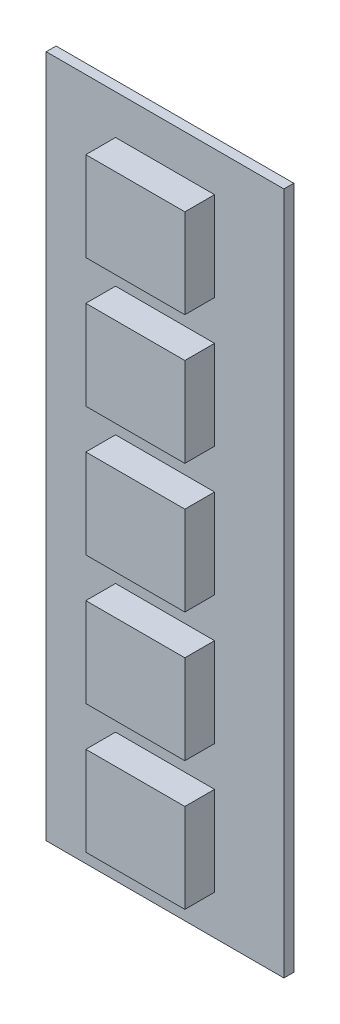
ISO-10303-21;
HEADER;
FILE_DESCRIPTION(('STEP AP214'),'2;1');
FILE_NAME('part.step','',(''),(''),'','','');
FILE_SCHEMA(('AUTOMOTIVE_DESIGN { 1 0 10303 214 1 1 1 1 }'));
ENDSEC;
DATA;
#1=APPLICATION_CONTEXT('core data for automotive mechanical design processes');
#2=APPLICATION_PROTOCOL_DEFINITION('international standard','automotive_design',2000,#1);
#3=PRODUCT_CONTEXT('',#1,'mechanical');
#4=PRODUCT('Part','Part','',(#3));
#5=PRODUCT_RELATED_PRODUCT_CATEGORY('part','',(#4));
#6=PRODUCT_DEFINITION_FORMATION('','',#4);
#7=PRODUCT_DEFINITION_CONTEXT('part definition',#1,'design');
#8=PRODUCT_DEFINITION('design','',#6,#7);
#9=PRODUCT_DEFINITION_SHAPE('','',#8);
#10=(LENGTH_UNIT() NAMED_UNIT(*) SI_UNIT(.MILLI.,.METRE.));
#11=(NAMED_UNIT(*) PLANE_ANGLE_UNIT() SI_UNIT($,.RADIAN.));
#12=(NAMED_UNIT(*) SI_UNIT($,.STERADIAN.) SOLID_ANGLE_UNIT());
#13=UNCERTAINTY_MEASURE_WITH_UNIT(LENGTH_MEASURE(1.E-05),#10,'distance_accuracy_value','');
#14=(GEOMETRIC_REPRESENTATION_CONTEXT(3) GLOBAL_UNCERTAINTY_ASSIGNED_CONTEXT((#13)) GLOBAL_UNIT_ASSIGNED_CONTEXT((#10,
#11,#12)) REPRESENTATION_CONTEXT('',''));
#15=CARTESIAN_POINT('',(0.,0.,0.));
#16=DIRECTION('',(0.,0.,1.));
#17=DIRECTION('',(1.,0.,0.));
#18=AXIS2_PLACEMENT_3D('',#15,#16,#17);
#19=CARTESIAN_POINT('',(0.,0.,0.5));
#20=DIRECTION('',(0.,0.,1.));
#21=DIRECTION('',(1.,0.,0.));
#22=AXIS2_PLACEMENT_3D('',#19,#20,#21);
#23=PLANE('',#22);
#24=DIRECTION('',(0.,-1.,0.));
#25=VECTOR('',#24,1.);
#26=CARTESIAN_POINT('',(-12.,35.2631521081853,0.5));
#27=LINE('',#26,#25);
#28=CARTESIAN_POINT('',(-12.,35.2631521081853,0.5));
#29=VERTEX_POINT('',#28);
#30=CARTESIAN_POINT('',(-12.,0.763152108185262,0.5));
#31=VERTEX_POINT('',#30);
#32=EDGE_CURVE('E398',#29,#31,#27,.T.);
#33=ORIENTED_EDGE('',*,*,#32,.T.);
#34=DIRECTION('',(1.,0.,0.));
#35=VECTOR('',#34,1.);
#36=CARTESIAN_POINT('',(-12.,0.763152108185262,0.5));
#37=LINE('',#36,#35);
#38=CARTESIAN_POINT('',(0.,0.763152108185262,0.5));
#39=VERTEX_POINT('',#38);
#40=EDGE_CURVE('E402',#31,#39,#37,.T.);
#41=ORIENTED_EDGE('',*,*,#40,.T.);
#42=DIRECTION('',(0.,1.,0.));
#43=VECTOR('',#42,1.);
#44=CARTESIAN_POINT('',(0.,35.2631521081853,0.5));
#45=LINE('',#44,#43);
#46=CARTESIAN_POINT('',(0.,35.2631521081853,0.5));
#47=VERTEX_POINT('',#46);
#48=EDGE_CURVE('E406',#39,#47,#45,.T.);
#49=ORIENTED_EDGE('',*,*,#48,.T.);
#50=DIRECTION('',(-1.,0.,0.));
#51=VECTOR('',#50,1.);
#52=CARTESIAN_POINT('',(-12.,35.2631521081853,0.5));
#53=LINE('',#52,#51);
#54=EDGE_CURVE('E409',#47,#29,#53,.T.);
#55=ORIENTED_EDGE('',*,*,#54,.T.);
#56=EDGE_LOOP('',(#33,#41,#49,#55));
#57=FACE_BOUND('',#56,.T.);
#58=DIRECTION('',(1.,0.,0.));
#59=VECTOR('',#58,1.);
#60=CARTESIAN_POINT('',(-8.5,28.7631521081853,0.5));
#61=LINE('',#60,#59);
#62=CARTESIAN_POINT('',(-8.5,28.7631521081853,0.5));
#63=VERTEX_POINT('',#62);
#64=CARTESIAN_POINT('',(-3.5,28.7631521081853,0.5));
#65=VERTEX_POINT('',#64);
#66=EDGE_CURVE('E375',#63,#65,#61,.T.);
#67=ORIENTED_EDGE('',*,*,#66,.F.);
#68=DIRECTION('',(0.,-1.,0.));
#69=VECTOR('',#68,1.);
#70=CARTESIAN_POINT('',(-8.5,33.2631521081853,0.5));
#71=LINE('',#70,#69);
#72=CARTESIAN_POINT('',(-8.5,33.2631521081853,0.5));
#73=VERTEX_POINT('',#72);
#74=EDGE_CURVE('E356',#73,#63,#71,.T.);
#75=ORIENTED_EDGE('',*,*,#74,.F.);
#76=DIRECTION('',(-1.,0.,0.));
#77=VECTOR('',#76,1.);
#78=CARTESIAN_POINT('',(-8.5,33.2631521081853,0.5));
#79=LINE('',#78,#77);
#80=CARTESIAN_POINT('',(-3.5,33.2631521081853,0.5));
#81=VERTEX_POINT('',#80);
#82=EDGE_CURVE('E362',#81,#73,#79,.T.);
#83=ORIENTED_EDGE('',*,*,#82,.F.);
#84=DIRECTION('',(0.,1.,0.));
#85=VECTOR('',#84,1.);
#86=CARTESIAN_POINT('',(-3.5,33.2631521081853,0.5));
#87=LINE('',#86,#85);
#88=EDGE_CURVE('E378',#65,#81,#87,.T.);
#89=ORIENTED_EDGE('',*,*,#88,.F.);
#90=EDGE_LOOP('',(#67,#75,#83,#89));
#91=FACE_BOUND('',#90,.T.);
#92=DIRECTION('',(0.,-1.,0.));
#93=VECTOR('',#92,1.);
#94=CARTESIAN_POINT('',(-8.5,26.7631521081853,0.5));
#95=LINE('',#94,#93);
#96=CARTESIAN_POINT('',(-8.5,26.7631521081853,0.5));
#97=VERTEX_POINT('',#96);
#98=CARTESIAN_POINT('',(-8.5,22.2631521081853,0.5));
#99=VERTEX_POINT('',#98);
#100=EDGE_CURVE('E334',#97,#99,#95,.T.);
#101=ORIENTED_EDGE('',*,*,#100,.F.);
#102=DIRECTION('',(-1.,0.,0.));
#103=VECTOR('',#102,1.);
#104=CARTESIAN_POINT('',(-8.5,26.7631521081853,0.5));
#105=LINE('',#104,#103);
#106=CARTESIAN_POINT('',(-3.5,26.7631521081853,0.5));
#107=VERTEX_POINT('',#106);
#108=EDGE_CURVE('E315',#107,#97,#105,.T.);
#109=ORIENTED_EDGE('',*,*,#108,.F.);
#110=DIRECTION('',(0.,1.,0.));
#111=VECTOR('',#110,1.);
#112=CARTESIAN_POINT('',(-3.5,26.7631521081853,0.5));
#113=LINE('',#112,#111);
#114=CARTESIAN_POINT('',(-3.5,22.2631521081853,0.5));
#115=VERTEX_POINT('',#114);
#116=EDGE_CURVE('E321',#115,#107,#113,.T.);
#117=ORIENTED_EDGE('',*,*,#116,.F.);
#118=DIRECTION('',(1.,0.,0.));
#119=VECTOR('',#118,1.);
#120=CARTESIAN_POINT('',(-8.5,22.2631521081853,0.5));
#121=LINE('',#120,#119);
#122=EDGE_CURVE('E337',#99,#115,#121,.T.);
#123=ORIENTED_EDGE('',*,*,#122,.F.);
#124=EDGE_LOOP('',(#101,#109,#117,#123));
#125=FACE_BOUND('',#124,.T.);
#126=DIRECTION('',(0.,-1.,0.));
#127=VECTOR('',#126,1.);
#128=CARTESIAN_POINT('',(-8.5,20.2631521081853,0.5));
#129=LINE('',#128,#127);
#130=CARTESIAN_POINT('',(-8.5,20.2631521081853,0.5));
#131=VERTEX_POINT('',#130);
#132=CARTESIAN_POINT('',(-8.5,15.7631521081853,0.5));
#133=VERTEX_POINT('',#132);
#134=EDGE_CURVE('E293',#131,#133,#129,.T.);
#135=ORIENTED_EDGE('',*,*,#134,.F.);
#136=DIRECTION('',(-1.,0.,0.));
#137=VECTOR('',#136,1.);
#138=CARTESIAN_POINT('',(-8.5,20.2631521081853,0.5));
#139=LINE('',#138,#137);
#140=CARTESIAN_POINT('',(-3.5,20.2631521081853,0.5));
#141=VERTEX_POINT('',#140);
#142=EDGE_CURVE('E274',#141,#131,#139,.T.);
#143=ORIENTED_EDGE('',*,*,#142,.F.);
#144=DIRECTION('',(0.,1.,0.));
#145=VECTOR('',#144,1.);
#146=CARTESIAN_POINT('',(-3.5,20.2631521081853,0.5));
#147=LINE('',#146,#145);
#148=CARTESIAN_POINT('',(-3.5,15.7631521081853,0.5));
#149=VERTEX_POINT('',#148);
#150=EDGE_CURVE('E280',#149,#141,#147,.T.);
#151=ORIENTED_EDGE('',*,*,#150,.F.);
#152=DIRECTION('',(1.,0.,0.));
#153=VECTOR('',#152,1.);
#154=CARTESIAN_POINT('',(-8.5,15.7631521081853,0.5));
#155=LINE('',#154,#153);
#156=EDGE_CURVE('E296',#133,#149,#155,.T.);
#157=ORIENTED_EDGE('',*,*,#156,.F.);
#158=EDGE_LOOP('',(#135,#143,#151,#157));
#159=FACE_BOUND('',#158,.T.);
#160=DIRECTION('',(0.,-1.,0.));
#161=VECTOR('',#160,1.);
#162=CARTESIAN_POINT('',(-8.5,13.7631521081853,0.5));
#163=LINE('',#162,#161);
#164=CARTESIAN_POINT('',(-8.5,13.7631521081853,0.5));
#165=VERTEX_POINT('',#164);
#166=CARTESIAN_POINT('',(-8.5,9.26315210818527,0.5));
#167=VERTEX_POINT('',#166);
#168=EDGE_CURVE('E235',#165,#167,#163,.T.);
#169=ORIENTED_EDGE('',*,*,#168,.F.);
#170=DIRECTION('',(-1.,0.,0.));
#171=VECTOR('',#170,1.);
#172=CARTESIAN_POINT('',(-8.5,13.7631521081853,0.5));
#173=LINE('',#172,#171);
#174=CARTESIAN_POINT('',(-3.5,13.7631521081853,0.5));
#175=VERTEX_POINT('',#174);
#176=EDGE_CURVE('E230',#175,#165,#173,.T.);
#177=ORIENTED_EDGE('',*,*,#176,.F.);
#178=DIRECTION('',(0.,1.,0.));
#179=VECTOR('',#178,1.);
#180=CARTESIAN_POINT('',(-3.5,13.7631521081853,0.5));
#181=LINE('',#180,#179);
#182=CARTESIAN_POINT('',(-3.5,9.26315210818527,0.5));
#183=VERTEX_POINT('',#182);
#184=EDGE_CURVE('E245',#183,#175,#181,.T.);
#185=ORIENTED_EDGE('',*,*,#184,.F.);
#186=DIRECTION('',(1.,0.,0.));
#187=VECTOR('',#186,1.);
#188=CARTESIAN_POINT('',(-8.5,9.26315210818527,0.5));
#189=LINE('',#188,#187);
#190=EDGE_CURVE('E257',#167,#183,#189,.T.);
#191=ORIENTED_EDGE('',*,*,#190,.F.);
#192=EDGE_LOOP('',(#169,#177,#185,#191));
#193=FACE_BOUND('',#192,.T.);
#194=DIRECTION('',(0.,-1.,0.));
#195=VECTOR('',#194,1.);
#196=CARTESIAN_POINT('',(-8.5,7.26315210818527,0.5));
#197=LINE('',#196,#195);
#198=CARTESIAN_POINT('',(-8.5,7.26315210818527,0.5));
#199=VERTEX_POINT('',#198);
#200=CARTESIAN_POINT('',(-8.5,2.76315210818527,0.5));
#201=VERTEX_POINT('',#200);
#202=EDGE_CURVE('E750',#199,#201,#197,.T.);
#203=ORIENTED_EDGE('',*,*,#202,.F.);
#204=DIRECTION('',(-1.,0.,0.));
#205=VECTOR('',#204,1.);
#206=CARTESIAN_POINT('',(-8.5,7.26315210818527,0.5));
#207=LINE('',#206,#205);
#208=CARTESIAN_POINT('',(-3.5,7.26315210818527,0.5));
#209=VERTEX_POINT('',#208);
#210=EDGE_CURVE('E227',#209,#199,#207,.T.);
#211=ORIENTED_EDGE('',*,*,#210,.F.);
#212=DIRECTION('',(0.,1.,0.));
#213=VECTOR('',#212,1.);
#214=CARTESIAN_POINT('',(-3.5,7.26315210818527,0.5));
#215=LINE('',#214,#213);
#216=CARTESIAN_POINT('',(-3.5,2.76315210818527,0.5));
#217=VERTEX_POINT('',#216);
#218=EDGE_CURVE('E223',#217,#209,#215,.T.);
#219=ORIENTED_EDGE('',*,*,#218,.F.);
#220=DIRECTION('',(1.,0.,0.));
#221=VECTOR('',#220,1.);
#222=CARTESIAN_POINT('',(-8.5,2.76315210818527,0.5));
#223=LINE('',#222,#221);
#224=EDGE_CURVE('E746',#201,#217,#223,.T.);
#225=ORIENTED_EDGE('',*,*,#224,.F.);
#226=EDGE_LOOP('',(#203,#211,#219,#225));
#227=FACE_BOUND('',#226,.T.);
#228=ADVANCED_FACE('F39',(#57,#91,#125,#159,#193,#227),#23,.T.);
#229=CARTESIAN_POINT('',(-12.,35.2631521081853,0.5));
#230=DIRECTION('',(1.,0.,0.));
#231=DIRECTION('',(0.,1.,0.));
#232=AXIS2_PLACEMENT_3D('',#229,#230,#231);
#233=PLANE('',#232);
#234=DIRECTION('',(0.,-1.,0.));
#235=VECTOR('',#234,1.);
#236=CARTESIAN_POINT('',(-12.,35.2631521081853,0.));
#237=LINE('',#236,#235);
#238=CARTESIAN_POINT('',(-12.,35.2631521081853,0.));
#239=VERTEX_POINT('',#238);
#240=CARTESIAN_POINT('',(-12.,0.763152108185262,0.));
#241=VERTEX_POINT('',#240);
#242=EDGE_CURVE('E397',#239,#241,#237,.T.);
#243=ORIENTED_EDGE('',*,*,#242,.T.);
#244=DIRECTION('',(0.,0.,-1.));
#245=VECTOR('',#244,1.);
#246=CARTESIAN_POINT('',(-12.,0.763152108185262,0.5));
#247=LINE('',#246,#245);
#248=EDGE_CURVE('E11',#31,#241,#247,.T.);
#249=ORIENTED_EDGE('',*,*,#248,.F.);
#250=ORIENTED_EDGE('',*,*,#32,.F.);
#251=DIRECTION('',(0.,0.,-1.));
#252=VECTOR('',#251,1.);
#253=CARTESIAN_POINT('',(-12.,35.2631521081853,0.5));
#254=LINE('',#253,#252);
#255=EDGE_CURVE('E412',#29,#239,#254,.T.);
#256=ORIENTED_EDGE('',*,*,#255,.T.);
#257=EDGE_LOOP('',(#243,#249,#250,#256));
#258=FACE_BOUND('',#257,.T.);
#259=ADVANCED_FACE('F41',(#258),#233,.F.);
#260=CARTESIAN_POINT('',(-12.,0.763152108185262,0.5));
#261=DIRECTION('',(0.,1.,0.));
#262=DIRECTION('',(0.,0.,1.));
#263=AXIS2_PLACEMENT_3D('',#260,#261,#262);
#264=PLANE('',#263);
#265=DIRECTION('',(1.,0.,0.));
#266=VECTOR('',#265,1.);
#267=CARTESIAN_POINT('',(-12.,0.763152108185262,0.));
#268=LINE('',#267,#266);
#269=CARTESIAN_POINT('',(0.,0.763152108185262,0.));
#270=VERTEX_POINT('',#269);
#271=EDGE_CURVE('E416',#241,#270,#268,.T.);
#272=ORIENTED_EDGE('',*,*,#271,.T.);
#273=DIRECTION('',(0.,0.,-1.));
#274=VECTOR('',#273,1.);
#275=CARTESIAN_POINT('',(0.,0.763152108185262,0.5));
#276=LINE('',#275,#274);
#277=EDGE_CURVE('E48',#39,#270,#276,.T.);
#278=ORIENTED_EDGE('',*,*,#277,.F.);
#279=ORIENTED_EDGE('',*,*,#40,.F.);
#280=ORIENTED_EDGE('',*,*,#248,.T.);
#281=EDGE_LOOP('',(#272,#278,#279,#280));
#282=FACE_BOUND('',#281,.T.);
#283=ADVANCED_FACE('F452',(#282),#264,.F.);
#284=CARTESIAN_POINT('',(0.,35.2631521081853,0.5));
#285=DIRECTION('',(-1.,0.,0.));
#286=DIRECTION('',(0.,-1.,0.));
#287=AXIS2_PLACEMENT_3D('',#284,#285,#286);
#288=PLANE('',#287);
#289=DIRECTION('',(0.,1.,0.));
#290=VECTOR('',#289,1.);
#291=CARTESIAN_POINT('',(0.,35.2631521081853,0.));
#292=LINE('',#291,#290);
#293=CARTESIAN_POINT('',(0.,35.2631521081853,0.));
#294=VERTEX_POINT('',#293);
#295=EDGE_CURVE('E419',#270,#294,#292,.T.);
#296=ORIENTED_EDGE('',*,*,#295,.T.);
#297=DIRECTION('',(0.,0.,-1.));
#298=VECTOR('',#297,1.);
#299=CARTESIAN_POINT('',(0.,35.2631521081853,0.5));
#300=LINE('',#299,#298);
#301=EDGE_CURVE('E427',#47,#294,#300,.T.);
#302=ORIENTED_EDGE('',*,*,#301,.F.);
#303=ORIENTED_EDGE('',*,*,#48,.F.);
#304=ORIENTED_EDGE('',*,*,#277,.T.);
#305=EDGE_LOOP('',(#296,#302,#303,#304));
#306=FACE_BOUND('',#305,.T.);
#307=ADVANCED_FACE('F436',(#306),#288,.F.);
#308=CARTESIAN_POINT('',(-12.,35.2631521081853,0.5));
#309=DIRECTION('',(0.,-1.,0.));
#310=DIRECTION('',(0.,0.,-1.));
#311=AXIS2_PLACEMENT_3D('',#308,#309,#310);
#312=PLANE('',#311);
#313=DIRECTION('',(-1.,0.,0.));
#314=VECTOR('',#313,1.);
#315=CARTESIAN_POINT('',(-12.,35.2631521081853,0.));
#316=LINE('',#315,#314);
#317=EDGE_CURVE('E403',#294,#239,#316,.T.);
#318=ORIENTED_EDGE('',*,*,#317,.T.);
#319=ORIENTED_EDGE('',*,*,#255,.F.);
#320=ORIENTED_EDGE('',*,*,#54,.F.);
#321=ORIENTED_EDGE('',*,*,#301,.T.);
#322=EDGE_LOOP('',(#318,#319,#320,#321));
#323=FACE_BOUND('',#322,.T.);
#324=ADVANCED_FACE('F445',(#323),#312,.F.);
#325=CARTESIAN_POINT('',(0.,0.,0.));
#326=DIRECTION('',(0.,0.,1.));
#327=DIRECTION('',(1.,0.,0.));
#328=AXIS2_PLACEMENT_3D('',#325,#326,#327);
#329=PLANE('',#328);
#330=ORIENTED_EDGE('',*,*,#242,.F.);
#331=ORIENTED_EDGE('',*,*,#317,.F.);
#332=ORIENTED_EDGE('',*,*,#295,.F.);
#333=ORIENTED_EDGE('',*,*,#271,.F.);
#334=EDGE_LOOP('',(#330,#331,#332,#333));
#335=FACE_BOUND('',#334,.T.);
#336=ADVANCED_FACE('F442',(#335),#329,.F.);
#337=CARTESIAN_POINT('',(-8.5,33.2631521081853,2.));
#338=DIRECTION('',(1.,0.,0.));
#339=DIRECTION('',(0.,0.,-1.));
#340=AXIS2_PLACEMENT_3D('',#337,#338,#339);
#341=PLANE('',#340);
#342=ORIENTED_EDGE('',*,*,#74,.T.);
#343=DIRECTION('',(0.,0.,-1.));
#344=VECTOR('',#343,1.);
#345=CARTESIAN_POINT('',(-8.5,28.7631521081853,2.));
#346=LINE('',#345,#344);
#347=CARTESIAN_POINT('',(-8.5,28.7631521081853,2.));
#348=VERTEX_POINT('',#347);
#349=EDGE_CURVE('E394',#348,#63,#346,.T.);
#350=ORIENTED_EDGE('',*,*,#349,.F.);
#351=DIRECTION('',(0.,-1.,0.));
#352=VECTOR('',#351,1.);
#353=CARTESIAN_POINT('',(-8.5,33.2631521081853,2.));
#354=LINE('',#353,#352);
#355=CARTESIAN_POINT('',(-8.5,33.2631521081853,2.));
#356=VERTEX_POINT('',#355);
#357=EDGE_CURVE('E357',#356,#348,#354,.T.);
#358=ORIENTED_EDGE('',*,*,#357,.F.);
#359=DIRECTION('',(0.,0.,-1.));
#360=VECTOR('',#359,1.);
#361=CARTESIAN_POINT('',(-8.5,33.2631521081853,2.));
#362=LINE('',#361,#360);
#363=EDGE_CURVE('E371',#356,#73,#362,.T.);
#364=ORIENTED_EDGE('',*,*,#363,.T.);
#365=EDGE_LOOP('',(#342,#350,#358,#364));
#366=FACE_BOUND('',#365,.T.);
#367=ADVANCED_FACE('F465',(#366),#341,.F.);
#368=CARTESIAN_POINT('',(-8.5,28.7631521081853,2.));
#369=DIRECTION('',(0.,1.,0.));
#370=DIRECTION('',(0.,0.,1.));
#371=AXIS2_PLACEMENT_3D('',#368,#369,#370);
#372=PLANE('',#371);
#373=ORIENTED_EDGE('',*,*,#66,.T.);
#374=DIRECTION('',(0.,0.,-1.));
#375=VECTOR('',#374,1.);
#376=CARTESIAN_POINT('',(-3.5,28.7631521081853,2.));
#377=LINE('',#376,#375);
#378=CARTESIAN_POINT('',(-3.5,28.7631521081853,2.));
#379=VERTEX_POINT('',#378);
#380=EDGE_CURVE('E390',#379,#65,#377,.T.);
#381=ORIENTED_EDGE('',*,*,#380,.F.);
#382=DIRECTION('',(1.,0.,0.));
#383=VECTOR('',#382,1.);
#384=CARTESIAN_POINT('',(-8.5,28.7631521081853,2.));
#385=LINE('',#384,#383);
#386=EDGE_CURVE('E361',#348,#379,#385,.T.);
#387=ORIENTED_EDGE('',*,*,#386,.F.);
#388=ORIENTED_EDGE('',*,*,#349,.T.);
#389=EDGE_LOOP('',(#373,#381,#387,#388));
#390=FACE_BOUND('',#389,.T.);
#391=ADVANCED_FACE('F484',(#390),#372,.F.);
#392=CARTESIAN_POINT('',(-3.5,33.2631521081853,2.));
#393=DIRECTION('',(-1.,0.,0.));
#394=DIRECTION('',(0.,0.,1.));
#395=AXIS2_PLACEMENT_3D('',#392,#393,#394);
#396=PLANE('',#395);
#397=ORIENTED_EDGE('',*,*,#88,.T.);
#398=DIRECTION('',(0.,0.,-1.));
#399=VECTOR('',#398,1.);
#400=CARTESIAN_POINT('',(-3.5,33.2631521081853,2.));
#401=LINE('',#400,#399);
#402=CARTESIAN_POINT('',(-3.5,33.2631521081853,2.));
#403=VERTEX_POINT('',#402);
#404=EDGE_CURVE('E387',#403,#81,#401,.T.);
#405=ORIENTED_EDGE('',*,*,#404,.F.);
#406=DIRECTION('',(0.,1.,0.));
#407=VECTOR('',#406,1.);
#408=CARTESIAN_POINT('',(-3.5,33.2631521081853,2.));
#409=LINE('',#408,#407);
#410=EDGE_CURVE('E365',#379,#403,#409,.T.);
#411=ORIENTED_EDGE('',*,*,#410,.F.);
#412=ORIENTED_EDGE('',*,*,#380,.T.);
#413=EDGE_LOOP('',(#397,#405,#411,#412));
#414=FACE_BOUND('',#413,.T.);
#415=ADVANCED_FACE('F491',(#414),#396,.F.);
#416=CARTESIAN_POINT('',(-8.5,33.2631521081853,2.));
#417=DIRECTION('',(0.,-1.,0.));
#418=DIRECTION('',(0.,0.,-1.));
#419=AXIS2_PLACEMENT_3D('',#416,#417,#418);
#420=PLANE('',#419);
#421=ORIENTED_EDGE('',*,*,#82,.T.);
#422=ORIENTED_EDGE('',*,*,#363,.F.);
#423=DIRECTION('',(-1.,0.,0.));
#424=VECTOR('',#423,1.);
#425=CARTESIAN_POINT('',(-8.5,33.2631521081853,2.));
#426=LINE('',#425,#424);
#427=EDGE_CURVE('E368',#403,#356,#426,.T.);
#428=ORIENTED_EDGE('',*,*,#427,.F.);
#429=ORIENTED_EDGE('',*,*,#404,.T.);
#430=EDGE_LOOP('',(#421,#422,#428,#429));
#431=FACE_BOUND('',#430,.T.);
#432=ADVANCED_FACE('F498',(#431),#420,.F.);
#433=CARTESIAN_POINT('',(0.,0.,2.));
#434=DIRECTION('',(0.,0.,1.));
#435=DIRECTION('',(1.,0.,0.));
#436=AXIS2_PLACEMENT_3D('',#433,#434,#435);
#437=PLANE('',#436);
#438=ORIENTED_EDGE('',*,*,#357,.T.);
#439=ORIENTED_EDGE('',*,*,#386,.T.);
#440=ORIENTED_EDGE('',*,*,#410,.T.);
#441=ORIENTED_EDGE('',*,*,#427,.T.);
#442=EDGE_LOOP('',(#438,#439,#440,#441));
#443=FACE_BOUND('',#442,.T.);
#444=ADVANCED_FACE('F506',(#443),#437,.T.);
#445=CARTESIAN_POINT('',(-8.5,26.7631521081853,2.));
#446=DIRECTION('',(0.,-1.,0.));
#447=DIRECTION('',(0.,0.,-1.));
#448=AXIS2_PLACEMENT_3D('',#445,#446,#447);
#449=PLANE('',#448);
#450=ORIENTED_EDGE('',*,*,#108,.T.);
#451=DIRECTION('',(0.,0.,-1.));
#452=VECTOR('',#451,1.);
#453=CARTESIAN_POINT('',(-8.5,26.7631521081853,2.));
#454=LINE('',#453,#452);
#455=CARTESIAN_POINT('',(-8.5,26.7631521081853,2.));
#456=VERTEX_POINT('',#455);
#457=EDGE_CURVE('E353',#456,#97,#454,.T.);
#458=ORIENTED_EDGE('',*,*,#457,.F.);
#459=DIRECTION('',(-1.,0.,0.));
#460=VECTOR('',#459,1.);
#461=CARTESIAN_POINT('',(-8.5,26.7631521081853,2.));
#462=LINE('',#461,#460);
#463=CARTESIAN_POINT('',(-3.5,26.7631521081853,2.));
#464=VERTEX_POINT('',#463);
#465=EDGE_CURVE('E316',#464,#456,#462,.T.);
#466=ORIENTED_EDGE('',*,*,#465,.F.);
#467=DIRECTION('',(0.,0.,-1.));
#468=VECTOR('',#467,1.);
#469=CARTESIAN_POINT('',(-3.5,26.7631521081853,2.));
#470=LINE('',#469,#468);
#471=EDGE_CURVE('E330',#464,#107,#470,.T.);
#472=ORIENTED_EDGE('',*,*,#471,.T.);
#473=EDGE_LOOP('',(#450,#458,#466,#472));
#474=FACE_BOUND('',#473,.T.);
#475=ADVANCED_FACE('F514',(#474),#449,.F.);
#476=CARTESIAN_POINT('',(-8.5,26.7631521081853,2.));
#477=DIRECTION('',(1.,0.,0.));
#478=DIRECTION('',(0.,0.,-1.));
#479=AXIS2_PLACEMENT_3D('',#476,#477,#478);
#480=PLANE('',#479);
#481=ORIENTED_EDGE('',*,*,#100,.T.);
#482=DIRECTION('',(0.,0.,-1.));
#483=VECTOR('',#482,1.);
#484=CARTESIAN_POINT('',(-8.5,22.2631521081853,2.));
#485=LINE('',#484,#483);
#486=CARTESIAN_POINT('',(-8.5,22.2631521081853,2.));
#487=VERTEX_POINT('',#486);
#488=EDGE_CURVE('E349',#487,#99,#485,.T.);
#489=ORIENTED_EDGE('',*,*,#488,.F.);
#490=DIRECTION('',(0.,-1.,0.));
#491=VECTOR('',#490,1.);
#492=CARTESIAN_POINT('',(-8.5,26.7631521081853,2.));
#493=LINE('',#492,#491);
#494=EDGE_CURVE('E320',#456,#487,#493,.T.);
#495=ORIENTED_EDGE('',*,*,#494,.F.);
#496=ORIENTED_EDGE('',*,*,#457,.T.);
#497=EDGE_LOOP('',(#481,#489,#495,#496));
#498=FACE_BOUND('',#497,.T.);
#499=ADVANCED_FACE('F522',(#498),#480,.F.);
#500=CARTESIAN_POINT('',(-8.5,22.2631521081853,2.));
#501=DIRECTION('',(0.,1.,0.));
#502=DIRECTION('',(0.,0.,1.));
#503=AXIS2_PLACEMENT_3D('',#500,#501,#502);
#504=PLANE('',#503);
#505=ORIENTED_EDGE('',*,*,#122,.T.);
#506=DIRECTION('',(0.,0.,-1.));
#507=VECTOR('',#506,1.);
#508=CARTESIAN_POINT('',(-3.5,22.2631521081853,2.));
#509=LINE('',#508,#507);
#510=CARTESIAN_POINT('',(-3.5,22.2631521081853,2.));
#511=VERTEX_POINT('',#510);
#512=EDGE_CURVE('E346',#511,#115,#509,.T.);
#513=ORIENTED_EDGE('',*,*,#512,.F.);
#514=DIRECTION('',(1.,0.,0.));
#515=VECTOR('',#514,1.);
#516=CARTESIAN_POINT('',(-8.5,22.2631521081853,2.));
#517=LINE('',#516,#515);
#518=EDGE_CURVE('E324',#487,#511,#517,.T.);
#519=ORIENTED_EDGE('',*,*,#518,.F.);
#520=ORIENTED_EDGE('',*,*,#488,.T.);
#521=EDGE_LOOP('',(#505,#513,#519,#520));
#522=FACE_BOUND('',#521,.T.);
#523=ADVANCED_FACE('F530',(#522),#504,.F.);
#524=CARTESIAN_POINT('',(-3.5,26.7631521081853,2.));
#525=DIRECTION('',(-1.,0.,0.));
#526=DIRECTION('',(0.,0.,1.));
#527=AXIS2_PLACEMENT_3D('',#524,#525,#526);
#528=PLANE('',#527);
#529=ORIENTED_EDGE('',*,*,#116,.T.);
#530=ORIENTED_EDGE('',*,*,#471,.F.);
#531=DIRECTION('',(0.,1.,0.));
#532=VECTOR('',#531,1.);
#533=CARTESIAN_POINT('',(-3.5,26.7631521081853,2.));
#534=LINE('',#533,#532);
#535=EDGE_CURVE('E327',#511,#464,#534,.T.);
#536=ORIENTED_EDGE('',*,*,#535,.F.);
#537=ORIENTED_EDGE('',*,*,#512,.T.);
#538=EDGE_LOOP('',(#529,#530,#536,#537));
#539=FACE_BOUND('',#538,.T.);
#540=ADVANCED_FACE('F538',(#539),#528,.F.);
#541=CARTESIAN_POINT('',(0.,0.,2.));
#542=DIRECTION('',(0.,0.,-1.));
#543=DIRECTION('',(-1.,0.,0.));
#544=AXIS2_PLACEMENT_3D('',#541,#542,#543);
#545=PLANE('',#544);
#546=ORIENTED_EDGE('',*,*,#465,.T.);
#547=ORIENTED_EDGE('',*,*,#494,.T.);
#548=ORIENTED_EDGE('',*,*,#518,.T.);
#549=ORIENTED_EDGE('',*,*,#535,.T.);
#550=EDGE_LOOP('',(#546,#547,#548,#549));
#551=FACE_BOUND('',#550,.T.);
#552=ADVANCED_FACE('F546',(#551),#545,.F.);
#553=CARTESIAN_POINT('',(-8.5,20.2631521081853,2.));
#554=DIRECTION('',(0.,-1.,0.));
#555=DIRECTION('',(0.,0.,-1.));
#556=AXIS2_PLACEMENT_3D('',#553,#554,#555);
#557=PLANE('',#556);
#558=ORIENTED_EDGE('',*,*,#142,.T.);
#559=DIRECTION('',(0.,0.,-1.));
#560=VECTOR('',#559,1.);
#561=CARTESIAN_POINT('',(-8.5,20.2631521081853,2.));
#562=LINE('',#561,#560);
#563=CARTESIAN_POINT('',(-8.5,20.2631521081853,2.));
#564=VERTEX_POINT('',#563);
#565=EDGE_CURVE('E312',#564,#131,#562,.T.);
#566=ORIENTED_EDGE('',*,*,#565,.F.);
#567=DIRECTION('',(-1.,0.,0.));
#568=VECTOR('',#567,1.);
#569=CARTESIAN_POINT('',(-8.5,20.2631521081853,2.));
#570=LINE('',#569,#568);
#571=CARTESIAN_POINT('',(-3.5,20.2631521081853,2.));
#572=VERTEX_POINT('',#571);
#573=EDGE_CURVE('E275',#572,#564,#570,.T.);
#574=ORIENTED_EDGE('',*,*,#573,.F.);
#575=DIRECTION('',(0.,0.,-1.));
#576=VECTOR('',#575,1.);
#577=CARTESIAN_POINT('',(-3.5,20.2631521081853,2.));
#578=LINE('',#577,#576);
#579=EDGE_CURVE('E289',#572,#141,#578,.T.);
#580=ORIENTED_EDGE('',*,*,#579,.T.);
#581=EDGE_LOOP('',(#558,#566,#574,#580));
#582=FACE_BOUND('',#581,.T.);
#583=ADVANCED_FACE('F554',(#582),#557,.F.);
#584=CARTESIAN_POINT('',(-8.5,20.2631521081853,2.));
#585=DIRECTION('',(1.,0.,0.));
#586=DIRECTION('',(0.,0.,-1.));
#587=AXIS2_PLACEMENT_3D('',#584,#585,#586);
#588=PLANE('',#587);
#589=ORIENTED_EDGE('',*,*,#134,.T.);
#590=DIRECTION('',(0.,0.,-1.));
#591=VECTOR('',#590,1.);
#592=CARTESIAN_POINT('',(-8.5,15.7631521081853,2.));
#593=LINE('',#592,#591);
#594=CARTESIAN_POINT('',(-8.5,15.7631521081853,2.));
#595=VERTEX_POINT('',#594);
#596=EDGE_CURVE('E308',#595,#133,#593,.T.);
#597=ORIENTED_EDGE('',*,*,#596,.F.);
#598=DIRECTION('',(0.,-1.,0.));
#599=VECTOR('',#598,1.);
#600=CARTESIAN_POINT('',(-8.5,20.2631521081853,2.));
#601=LINE('',#600,#599);
#602=EDGE_CURVE('E279',#564,#595,#601,.T.);
#603=ORIENTED_EDGE('',*,*,#602,.F.);
#604=ORIENTED_EDGE('',*,*,#565,.T.);
#605=EDGE_LOOP('',(#589,#597,#603,#604));
#606=FACE_BOUND('',#605,.T.);
#607=ADVANCED_FACE('F562',(#606),#588,.F.);
#608=CARTESIAN_POINT('',(-8.5,15.7631521081853,2.));
#609=DIRECTION('',(0.,1.,0.));
#610=DIRECTION('',(0.,0.,1.));
#611=AXIS2_PLACEMENT_3D('',#608,#609,#610);
#612=PLANE('',#611);
#613=ORIENTED_EDGE('',*,*,#156,.T.);
#614=DIRECTION('',(0.,0.,-1.));
#615=VECTOR('',#614,1.);
#616=CARTESIAN_POINT('',(-3.5,15.7631521081853,2.));
#617=LINE('',#616,#615);
#618=CARTESIAN_POINT('',(-3.5,15.7631521081853,2.));
#619=VERTEX_POINT('',#618);
#620=EDGE_CURVE('E305',#619,#149,#617,.T.);
#621=ORIENTED_EDGE('',*,*,#620,.F.);
#622=DIRECTION('',(1.,0.,0.));
#623=VECTOR('',#622,1.);
#624=CARTESIAN_POINT('',(-8.5,15.7631521081853,2.));
#625=LINE('',#624,#623);
#626=EDGE_CURVE('E283',#595,#619,#625,.T.);
#627=ORIENTED_EDGE('',*,*,#626,.F.);
#628=ORIENTED_EDGE('',*,*,#596,.T.);
#629=EDGE_LOOP('',(#613,#621,#627,#628));
#630=FACE_BOUND('',#629,.T.);
#631=ADVANCED_FACE('F570',(#630),#612,.F.);
#632=CARTESIAN_POINT('',(-3.5,20.2631521081853,2.));
#633=DIRECTION('',(-1.,0.,0.));
#634=DIRECTION('',(0.,0.,1.));
#635=AXIS2_PLACEMENT_3D('',#632,#633,#634);
#636=PLANE('',#635);
#637=ORIENTED_EDGE('',*,*,#150,.T.);
#638=ORIENTED_EDGE('',*,*,#579,.F.);
#639=DIRECTION('',(0.,1.,0.));
#640=VECTOR('',#639,1.);
#641=CARTESIAN_POINT('',(-3.5,20.2631521081853,2.));
#642=LINE('',#641,#640);
#643=EDGE_CURVE('E286',#619,#572,#642,.T.);
#644=ORIENTED_EDGE('',*,*,#643,.F.);
#645=ORIENTED_EDGE('',*,*,#620,.T.);
#646=EDGE_LOOP('',(#637,#638,#644,#645));
#647=FACE_BOUND('',#646,.T.);
#648=ADVANCED_FACE('F578',(#647),#636,.F.);
#649=CARTESIAN_POINT('',(0.,0.,2.));
#650=DIRECTION('',(0.,0.,-1.));
#651=DIRECTION('',(-1.,0.,0.));
#652=AXIS2_PLACEMENT_3D('',#649,#650,#651);
#653=PLANE('',#652);
#654=ORIENTED_EDGE('',*,*,#573,.T.);
#655=ORIENTED_EDGE('',*,*,#602,.T.);
#656=ORIENTED_EDGE('',*,*,#626,.T.);
#657=ORIENTED_EDGE('',*,*,#643,.T.);
#658=EDGE_LOOP('',(#654,#655,#656,#657));
#659=FACE_BOUND('',#658,.T.);
#660=ADVANCED_FACE('F586',(#659),#653,.F.);
#661=CARTESIAN_POINT('',(-8.5,13.7631521081853,2.));
#662=DIRECTION('',(0.,-1.,0.));
#663=DIRECTION('',(0.,0.,-1.));
#664=AXIS2_PLACEMENT_3D('',#661,#662,#663);
#665=PLANE('',#664);
#666=ORIENTED_EDGE('',*,*,#176,.T.);
#667=DIRECTION('',(0.,0.,-1.));
#668=VECTOR('',#667,1.);
#669=CARTESIAN_POINT('',(-8.5,13.7631521081853,2.));
#670=LINE('',#669,#668);
#671=CARTESIAN_POINT('',(-8.5,13.7631521081853,2.));
#672=VERTEX_POINT('',#671);
#673=EDGE_CURVE('E271',#672,#165,#670,.T.);
#674=ORIENTED_EDGE('',*,*,#673,.F.);
#675=DIRECTION('',(-1.,0.,0.));
#676=VECTOR('',#675,1.);
#677=CARTESIAN_POINT('',(-8.5,13.7631521081853,2.));
#678=LINE('',#677,#676);
#679=CARTESIAN_POINT('',(-3.5,13.7631521081853,2.));
#680=VERTEX_POINT('',#679);
#681=EDGE_CURVE('E240',#680,#672,#678,.T.);
#682=ORIENTED_EDGE('',*,*,#681,.F.);
#683=DIRECTION('',(0.,0.,-1.));
#684=VECTOR('',#683,1.);
#685=CARTESIAN_POINT('',(-3.5,13.7631521081853,2.));
#686=LINE('',#685,#684);
#687=EDGE_CURVE('E253',#680,#175,#686,.T.);
#688=ORIENTED_EDGE('',*,*,#687,.T.);
#689=EDGE_LOOP('',(#666,#674,#682,#688));
#690=FACE_BOUND('',#689,.T.);
#691=ADVANCED_FACE('F594',(#690),#665,.F.);
#692=CARTESIAN_POINT('',(-8.5,13.7631521081853,2.));
#693=DIRECTION('',(1.,0.,0.));
#694=DIRECTION('',(0.,0.,-1.));
#695=AXIS2_PLACEMENT_3D('',#692,#693,#694);
#696=PLANE('',#695);
#697=ORIENTED_EDGE('',*,*,#168,.T.);
#698=DIRECTION('',(0.,0.,-1.));
#699=VECTOR('',#698,1.);
#700=CARTESIAN_POINT('',(-8.5,9.26315210818527,2.));
#701=LINE('',#700,#699);
#702=CARTESIAN_POINT('',(-8.5,9.26315210818527,2.));
#703=VERTEX_POINT('',#702);
#704=EDGE_CURVE('E267',#703,#167,#701,.T.);
#705=ORIENTED_EDGE('',*,*,#704,.F.);
#706=DIRECTION('',(0.,-1.,0.));
#707=VECTOR('',#706,1.);
#708=CARTESIAN_POINT('',(-8.5,13.7631521081853,2.));
#709=LINE('',#708,#707);
#710=EDGE_CURVE('E244',#672,#703,#709,.T.);
#711=ORIENTED_EDGE('',*,*,#710,.F.);
#712=ORIENTED_EDGE('',*,*,#673,.T.);
#713=EDGE_LOOP('',(#697,#705,#711,#712));
#714=FACE_BOUND('',#713,.T.);
#715=ADVANCED_FACE('F602',(#714),#696,.F.);
#716=CARTESIAN_POINT('',(-8.5,9.26315210818527,2.));
#717=DIRECTION('',(0.,1.,0.));
#718=DIRECTION('',(0.,0.,1.));
#719=AXIS2_PLACEMENT_3D('',#716,#717,#718);
#720=PLANE('',#719);
#721=ORIENTED_EDGE('',*,*,#190,.T.);
#722=DIRECTION('',(0.,0.,-1.));
#723=VECTOR('',#722,1.);
#724=CARTESIAN_POINT('',(-3.5,9.26315210818527,2.));
#725=LINE('',#724,#723);
#726=CARTESIAN_POINT('',(-3.5,9.26315210818527,2.));
#727=VERTEX_POINT('',#726);
#728=EDGE_CURVE('E63',#727,#183,#725,.T.);
#729=ORIENTED_EDGE('',*,*,#728,.F.);
#730=DIRECTION('',(1.,0.,0.));
#731=VECTOR('',#730,1.);
#732=CARTESIAN_POINT('',(-8.5,9.26315210818527,2.));
#733=LINE('',#732,#731);
#734=EDGE_CURVE('E248',#703,#727,#733,.T.);
#735=ORIENTED_EDGE('',*,*,#734,.F.);
#736=ORIENTED_EDGE('',*,*,#704,.T.);
#737=EDGE_LOOP('',(#721,#729,#735,#736));
#738=FACE_BOUND('',#737,.T.);
#739=ADVANCED_FACE('F610',(#738),#720,.F.);
#740=CARTESIAN_POINT('',(-3.5,13.7631521081853,2.));
#741=DIRECTION('',(-1.,0.,0.));
#742=DIRECTION('',(0.,0.,1.));
#743=AXIS2_PLACEMENT_3D('',#740,#741,#742);
#744=PLANE('',#743);
#745=ORIENTED_EDGE('',*,*,#184,.T.);
#746=ORIENTED_EDGE('',*,*,#687,.F.);
#747=DIRECTION('',(0.,1.,0.));
#748=VECTOR('',#747,1.);
#749=CARTESIAN_POINT('',(-3.5,13.7631521081853,2.));
#750=LINE('',#749,#748);
#751=EDGE_CURVE('E251',#727,#680,#750,.T.);
#752=ORIENTED_EDGE('',*,*,#751,.F.);
#753=ORIENTED_EDGE('',*,*,#728,.T.);
#754=EDGE_LOOP('',(#745,#746,#752,#753));
#755=FACE_BOUND('',#754,.T.);
#756=ADVANCED_FACE('F618',(#755),#744,.F.);
#757=CARTESIAN_POINT('',(0.,0.,2.));
#758=DIRECTION('',(0.,0.,-1.));
#759=DIRECTION('',(-1.,0.,0.));
#760=AXIS2_PLACEMENT_3D('',#757,#758,#759);
#761=PLANE('',#760);
#762=ORIENTED_EDGE('',*,*,#681,.T.);
#763=ORIENTED_EDGE('',*,*,#710,.T.);
#764=ORIENTED_EDGE('',*,*,#734,.T.);
#765=ORIENTED_EDGE('',*,*,#751,.T.);
#766=EDGE_LOOP('',(#762,#763,#764,#765));
#767=FACE_BOUND('',#766,.T.);
#768=ADVANCED_FACE('F626',(#767),#761,.F.);
#769=CARTESIAN_POINT('',(-8.5,7.26315210818527,2.));
#770=DIRECTION('',(0.,-1.,0.));
#771=DIRECTION('',(0.,0.,-1.));
#772=AXIS2_PLACEMENT_3D('',#769,#770,#771);
#773=PLANE('',#772);
#774=ORIENTED_EDGE('',*,*,#210,.T.);
#775=DIRECTION('',(0.,0.,-1.));
#776=VECTOR('',#775,1.);
#777=CARTESIAN_POINT('',(-8.5,7.26315210818527,2.));
#778=LINE('',#777,#776);
#779=CARTESIAN_POINT('',(-8.5,7.26315210818527,2.));
#780=VERTEX_POINT('',#779);
#781=EDGE_CURVE('E206',#780,#199,#778,.T.);
#782=ORIENTED_EDGE('',*,*,#781,.F.);
#783=DIRECTION('',(-1.,0.,0.));
#784=VECTOR('',#783,1.);
#785=CARTESIAN_POINT('',(-8.5,7.26315210818527,2.));
#786=LINE('',#785,#784);
#787=CARTESIAN_POINT('',(-3.5,7.26315210818527,2.));
#788=VERTEX_POINT('',#787);
#789=EDGE_CURVE('E214',#788,#780,#786,.T.);
#790=ORIENTED_EDGE('',*,*,#789,.F.);
#791=DIRECTION('',(0.,0.,-1.));
#792=VECTOR('',#791,1.);
#793=CARTESIAN_POINT('',(-3.5,7.26315210818527,2.));
#794=LINE('',#793,#792);
#795=EDGE_CURVE('E742',#788,#209,#794,.T.);
#796=ORIENTED_EDGE('',*,*,#795,.T.);
#797=EDGE_LOOP('',(#774,#782,#790,#796));
#798=FACE_BOUND('',#797,.T.);
#799=ADVANCED_FACE('F225',(#798),#773,.F.);
#800=CARTESIAN_POINT('',(-8.5,7.26315210818527,2.));
#801=DIRECTION('',(1.,0.,0.));
#802=DIRECTION('',(0.,0.,-1.));
#803=AXIS2_PLACEMENT_3D('',#800,#801,#802);
#804=PLANE('',#803);
#805=ORIENTED_EDGE('',*,*,#202,.T.);
#806=DIRECTION('',(0.,0.,-1.));
#807=VECTOR('',#806,1.);
#808=CARTESIAN_POINT('',(-8.5,2.76315210818527,2.));
#809=LINE('',#808,#807);
#810=CARTESIAN_POINT('',(-8.5,2.76315210818527,2.));
#811=VERTEX_POINT('',#810);
#812=EDGE_CURVE('E209',#811,#201,#809,.T.);
#813=ORIENTED_EDGE('',*,*,#812,.F.);
#814=DIRECTION('',(0.,-1.,0.));
#815=VECTOR('',#814,1.);
#816=CARTESIAN_POINT('',(-8.5,7.26315210818527,2.));
#817=LINE('',#816,#815);
#818=EDGE_CURVE('E202',#780,#811,#817,.T.);
#819=ORIENTED_EDGE('',*,*,#818,.F.);
#820=ORIENTED_EDGE('',*,*,#781,.T.);
#821=EDGE_LOOP('',(#805,#813,#819,#820));
#822=FACE_BOUND('',#821,.T.);
#823=ADVANCED_FACE('F204',(#822),#804,.F.);
#824=CARTESIAN_POINT('',(-8.5,2.76315210818527,2.));
#825=DIRECTION('',(0.,1.,0.));
#826=DIRECTION('',(0.,0.,1.));
#827=AXIS2_PLACEMENT_3D('',#824,#825,#826);
#828=PLANE('',#827);
#829=ORIENTED_EDGE('',*,*,#224,.T.);
#830=DIRECTION('',(0.,0.,-1.));
#831=VECTOR('',#830,1.);
#832=CARTESIAN_POINT('',(-3.5,2.76315210818527,2.));
#833=LINE('',#832,#831);
#834=CARTESIAN_POINT('',(-3.5,2.76315210818527,2.));
#835=VERTEX_POINT('',#834);
#836=EDGE_CURVE('E55',#835,#217,#833,.T.);
#837=ORIENTED_EDGE('',*,*,#836,.F.);
#838=DIRECTION('',(1.,0.,0.));
#839=VECTOR('',#838,1.);
#840=CARTESIAN_POINT('',(-8.5,2.76315210818527,2.));
#841=LINE('',#840,#839);
#842=EDGE_CURVE('E213',#811,#835,#841,.T.);
#843=ORIENTED_EDGE('',*,*,#842,.F.);
#844=ORIENTED_EDGE('',*,*,#812,.T.);
#845=EDGE_LOOP('',(#829,#837,#843,#844));
#846=FACE_BOUND('',#845,.T.);
#847=ADVANCED_FACE('F646',(#846),#828,.F.);
#848=CARTESIAN_POINT('',(-3.5,7.26315210818527,2.));
#849=DIRECTION('',(-1.,0.,0.));
#850=DIRECTION('',(0.,0.,1.));
#851=AXIS2_PLACEMENT_3D('',#848,#849,#850);
#852=PLANE('',#851);
#853=ORIENTED_EDGE('',*,*,#218,.T.);
#854=ORIENTED_EDGE('',*,*,#795,.F.);
#855=DIRECTION('',(0.,1.,0.));
#856=VECTOR('',#855,1.);
#857=CARTESIAN_POINT('',(-3.5,7.26315210818527,2.));
#858=LINE('',#857,#856);
#859=EDGE_CURVE('E218',#835,#788,#858,.T.);
#860=ORIENTED_EDGE('',*,*,#859,.F.);
#861=ORIENTED_EDGE('',*,*,#836,.T.);
#862=EDGE_LOOP('',(#853,#854,#860,#861));
#863=FACE_BOUND('',#862,.T.);
#864=ADVANCED_FACE('F653',(#863),#852,.F.);
#865=CARTESIAN_POINT('',(0.,0.,2.));
#866=DIRECTION('',(0.,0.,-1.));
#867=DIRECTION('',(-1.,0.,0.));
#868=AXIS2_PLACEMENT_3D('',#865,#866,#867);
#869=PLANE('',#868);
#870=ORIENTED_EDGE('',*,*,#789,.T.);
#871=ORIENTED_EDGE('',*,*,#818,.T.);
#872=ORIENTED_EDGE('',*,*,#842,.T.);
#873=ORIENTED_EDGE('',*,*,#859,.T.);
#874=EDGE_LOOP('',(#870,#871,#872,#873));
#875=FACE_BOUND('',#874,.T.);
#876=ADVANCED_FACE('F217',(#875),#869,.F.);
#877=CLOSED_SHELL('',(#228,#259,#283,#307,#324,#336,#367,#391,#415,#432,#444,#475,#499,#523,
#540,#552,#583,#607,#631,#648,#660,#691,#715,#739,#756,#768,#799,#823,#847,#864,#876));
#878=MANIFOLD_SOLID_BREP('B2',#877);
#879=ADVANCED_BREP_SHAPE_REPRESENTATION('',(#18,#878),#14);
#880=SHAPE_DEFINITION_REPRESENTATION(#9,#879);
ENDSEC;
END-ISO-10303-21;
